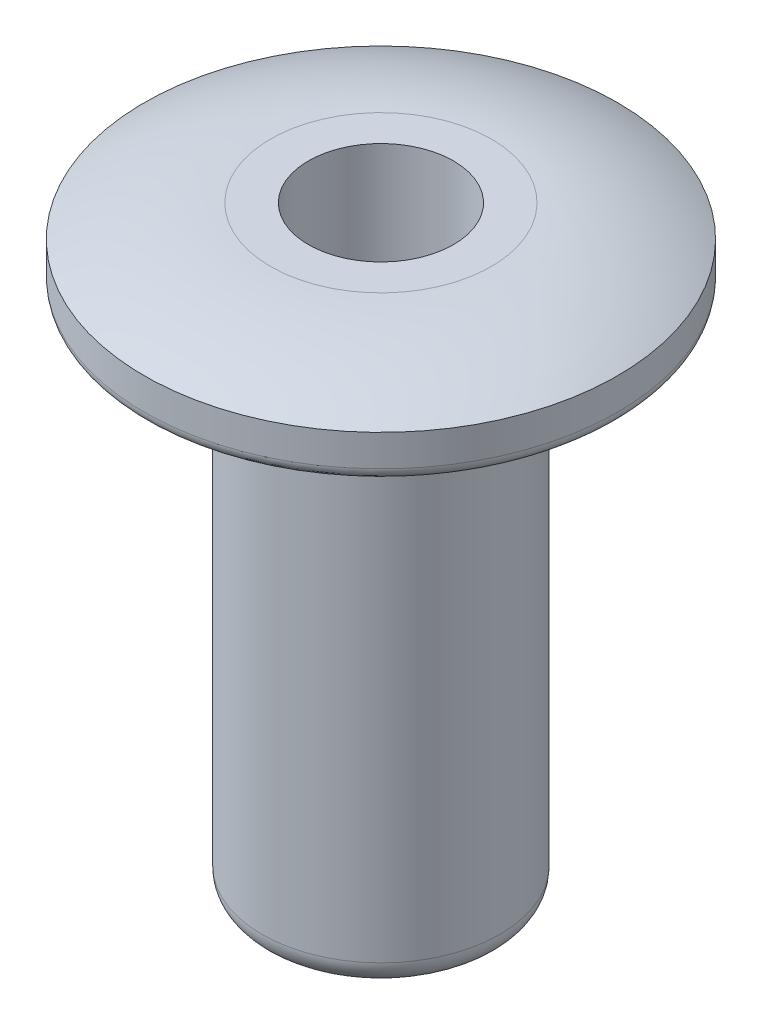
ISO-10303-21;
HEADER;
FILE_DESCRIPTION(('STEP AP214'),'2;1');
FILE_NAME('part.step','',(''),(''),'','','');
FILE_SCHEMA(('AUTOMOTIVE_DESIGN { 1 0 10303 214 1 1 1 1 }'));
ENDSEC;
DATA;
#1=APPLICATION_CONTEXT('core data for automotive mechanical design processes');
#2=APPLICATION_PROTOCOL_DEFINITION('international standard','automotive_design',2000,#1);
#3=PRODUCT_CONTEXT('',#1,'mechanical');
#4=PRODUCT('Part','Part','',(#3));
#5=PRODUCT_RELATED_PRODUCT_CATEGORY('part','',(#4));
#6=PRODUCT_DEFINITION_FORMATION('','',#4);
#7=PRODUCT_DEFINITION_CONTEXT('part definition',#1,'design');
#8=PRODUCT_DEFINITION('design','',#6,#7);
#9=PRODUCT_DEFINITION_SHAPE('','',#8);
#10=(LENGTH_UNIT() NAMED_UNIT(*) SI_UNIT(.MILLI.,.METRE.));
#11=(NAMED_UNIT(*) PLANE_ANGLE_UNIT() SI_UNIT($,.RADIAN.));
#12=(NAMED_UNIT(*) SI_UNIT($,.STERADIAN.) SOLID_ANGLE_UNIT());
#13=UNCERTAINTY_MEASURE_WITH_UNIT(LENGTH_MEASURE(1.E-05),#10,'distance_accuracy_value','');
#14=(GEOMETRIC_REPRESENTATION_CONTEXT(3) GLOBAL_UNCERTAINTY_ASSIGNED_CONTEXT((#13)) GLOBAL_UNIT_ASSIGNED_CONTEXT((#10,
#11,#12)) REPRESENTATION_CONTEXT('',''));
#15=CARTESIAN_POINT('',(0.,0.,0.));
#16=DIRECTION('',(0.,0.,1.));
#17=DIRECTION('',(1.,0.,0.));
#18=AXIS2_PLACEMENT_3D('',#15,#16,#17);
#19=CARTESIAN_POINT('',(-1.4605,12.065,0.));
#20=DIRECTION('',(0.,-1.,0.));
#21=DIRECTION('',(0.,0.,-1.));
#22=AXIS2_PLACEMENT_3D('',#19,#20,#21);
#23=PLANE('',#22);
#24=CARTESIAN_POINT('',(0.,12.065,0.));
#25=DIRECTION('',(0.,-1.,0.));
#26=DIRECTION('',(0.,0.,-1.));
#27=AXIS2_PLACEMENT_3D('',#24,#25,#26);
#28=CIRCLE('',#27,1.4605);
#29=CARTESIAN_POINT('',(0.,12.065,-1.4605));
#30=VERTEX_POINT('',#29);
#31=EDGE_CURVE('E18',#30,#30,#28,.T.);
#32=ORIENTED_EDGE('',*,*,#31,.T.);
#33=EDGE_LOOP('',(#32));
#34=FACE_BOUND('',#33,.T.);
#35=CARTESIAN_POINT('',(0.,12.065,0.));
#36=DIRECTION('',(0.,-1.,0.));
#37=DIRECTION('',(0.,0.,-1.));
#38=AXIS2_PLACEMENT_3D('',#35,#36,#37);
#39=CIRCLE('',#38,2.2225);
#40=CARTESIAN_POINT('',(0.,12.065,-2.2225));
#41=VERTEX_POINT('',#40);
#42=EDGE_CURVE('E47',#41,#41,#39,.T.);
#43=ORIENTED_EDGE('',*,*,#42,.F.);
#44=EDGE_LOOP('',(#43));
#45=FACE_BOUND('',#44,.T.);
#46=ADVANCED_FACE('F14',(#34,#45),#23,.F.);
#47=CARTESIAN_POINT('',(0.,6.66749999999997,-2.2225));
#48=DIRECTION('',(1.,0.,0.));
#49=DIRECTION('',(0.,0.,-1.));
#50=AXIS2_PLACEMENT_3D('',#47,#48,#49);
#51=CIRCLE('',#50,5.39750000000002);
#52=TRIMMED_CURVE('',#51,(PARAMETER_VALUE(-1.99518603538808)),
(PARAMETER_VALUE(1.99518603538808)),.T.,.PARAMETER.);
#53=CARTESIAN_POINT('',(0.,6.66749999999997,0.));
#54=DIRECTION('',(0.,-1.,0.));
#55=AXIS1_PLACEMENT('',#53,#54);
#56=SURFACE_OF_REVOLUTION('',#52,#55);
#57=ORIENTED_EDGE('',*,*,#42,.T.);
#58=EDGE_LOOP('',(#57));
#59=FACE_BOUND('',#58,.T.);
#60=CARTESIAN_POINT('',(0.,11.43,0.));
#61=DIRECTION('',(0.,-1.,0.));
#62=DIRECTION('',(0.,0.,-1.));
#63=AXIS2_PLACEMENT_3D('',#60,#61,#62);
#64=CIRCLE('',#63,4.7625);
#65=CARTESIAN_POINT('',(0.,11.43,-4.7625));
#66=VERTEX_POINT('',#65);
#67=EDGE_CURVE('E36',#66,#66,#64,.T.);
#68=ORIENTED_EDGE('',*,*,#67,.F.);
#69=EDGE_LOOP('',(#68));
#70=FACE_BOUND('',#69,.T.);
#71=ADVANCED_FACE('F60',(#59,#70),#56,.F.);
#72=CARTESIAN_POINT('',(0.,0.,0.));
#73=DIRECTION('',(0.,-1.,0.));
#74=DIRECTION('',(0.,0.,-1.));
#75=AXIS2_PLACEMENT_3D('',#72,#73,#74);
#76=CYLINDRICAL_SURFACE('',#75,1.4605);
#77=CARTESIAN_POINT('',(0.,0.,0.));
#78=DIRECTION('',(0.,-1.,0.));
#79=DIRECTION('',(0.,0.,-1.));
#80=AXIS2_PLACEMENT_3D('',#77,#78,#79);
#81=CIRCLE('',#80,1.4605);
#82=CARTESIAN_POINT('',(0.,0.,-1.4605));
#83=VERTEX_POINT('',#82);
#84=EDGE_CURVE('E33',#83,#83,#81,.T.);
#85=ORIENTED_EDGE('',*,*,#84,.T.);
#86=EDGE_LOOP('',(#85));
#87=FACE_BOUND('',#86,.T.);
#88=ORIENTED_EDGE('',*,*,#31,.F.);
#89=EDGE_LOOP('',(#88));
#90=FACE_BOUND('',#89,.T.);
#91=ADVANCED_FACE('F64',(#87,#90),#76,.F.);
#92=CARTESIAN_POINT('',(0.,0.,0.));
#93=DIRECTION('',(0.,-1.,0.));
#94=DIRECTION('',(0.,0.,-1.));
#95=AXIS2_PLACEMENT_3D('',#92,#93,#94);
#96=CYLINDRICAL_SURFACE('',#95,4.7625);
#97=ORIENTED_EDGE('',*,*,#67,.T.);
#98=EDGE_LOOP('',(#97));
#99=FACE_BOUND('',#98,.T.);
#100=CARTESIAN_POINT('',(0.,10.795,0.));
#101=DIRECTION('',(0.,-1.,0.));
#102=DIRECTION('',(0.,0.,-1.));
#103=AXIS2_PLACEMENT_3D('',#100,#101,#102);
#104=CIRCLE('',#103,4.7625);
#105=CARTESIAN_POINT('',(0.,10.795,-4.7625));
#106=VERTEX_POINT('',#105);
#107=EDGE_CURVE('E35',#106,#106,#104,.T.);
#108=ORIENTED_EDGE('',*,*,#107,.F.);
#109=EDGE_LOOP('',(#108));
#110=FACE_BOUND('',#109,.T.);
#111=ADVANCED_FACE('F68',(#99,#110),#96,.T.);
#112=CARTESIAN_POINT('',(-2.39395,0.,0.));
#113=DIRECTION('',(0.,1.,0.));
#114=DIRECTION('',(0.,0.,1.));
#115=AXIS2_PLACEMENT_3D('',#112,#113,#114);
#116=PLANE('',#115);
#117=ORIENTED_EDGE('',*,*,#84,.F.);
#118=EDGE_LOOP('',(#117));
#119=FACE_BOUND('',#118,.T.);
#120=CARTESIAN_POINT('',(0.,0.,0.));
#121=DIRECTION('',(0.,1.,0.));
#122=DIRECTION('',(0.,0.,1.));
#123=AXIS2_PLACEMENT_3D('',#120,#121,#122);
#124=CIRCLE('',#123,1.88595);
#125=CARTESIAN_POINT('',(0.,0.,1.88595));
#126=VERTEX_POINT('',#125);
#127=EDGE_CURVE('E40',#126,#126,#124,.T.);
#128=ORIENTED_EDGE('',*,*,#127,.F.);
#129=EDGE_LOOP('',(#128));
#130=FACE_BOUND('',#129,.T.);
#131=ADVANCED_FACE('F71',(#119,#130),#116,.F.);
#132=CARTESIAN_POINT('',(0.,10.795,0.));
#133=DIRECTION('',(0.,-1.,0.));
#134=DIRECTION('',(0.,0.,-1.));
#135=AXIS2_PLACEMENT_3D('',#132,#133,#134);
#136=TOROIDAL_SURFACE('',#135,4.5085,0.254000000000002);
#137=ORIENTED_EDGE('',*,*,#107,.T.);
#138=EDGE_LOOP('',(#137));
#139=FACE_BOUND('',#138,.T.);
#140=CARTESIAN_POINT('',(0.,10.541,0.));
#141=DIRECTION('',(0.,1.,0.));
#142=DIRECTION('',(0.,0.,-1.));
#143=AXIS2_PLACEMENT_3D('',#140,#141,#142);
#144=CIRCLE('',#143,4.5085);
#145=CARTESIAN_POINT('',(0.,10.541,-4.5085));
#146=VERTEX_POINT('',#145);
#147=EDGE_CURVE('E27',#146,#146,#144,.T.);
#148=ORIENTED_EDGE('',*,*,#147,.T.);
#149=EDGE_LOOP('',(#148));
#150=FACE_BOUND('',#149,.T.);
#151=ADVANCED_FACE('F75',(#139,#150),#136,.T.);
#152=CARTESIAN_POINT('',(0.,0.508,0.));
#153=DIRECTION('',(0.,1.,0.));
#154=DIRECTION('',(0.,0.,1.));
#155=AXIS2_PLACEMENT_3D('',#152,#153,#154);
#156=TOROIDAL_SURFACE('',#155,1.88595,0.508);
#157=ORIENTED_EDGE('',*,*,#127,.T.);
#158=EDGE_LOOP('',(#157));
#159=FACE_BOUND('',#158,.T.);
#160=CARTESIAN_POINT('',(0.,0.508,0.));
#161=DIRECTION('',(0.,-1.,0.));
#162=DIRECTION('',(0.,0.,-1.));
#163=AXIS2_PLACEMENT_3D('',#160,#161,#162);
#164=CIRCLE('',#163,2.39395);
#165=CARTESIAN_POINT('',(0.,0.508,-2.39395));
#166=VERTEX_POINT('',#165);
#167=EDGE_CURVE('E22',#166,#166,#164,.F.);
#168=ORIENTED_EDGE('',*,*,#167,.F.);
#169=EDGE_LOOP('',(#168));
#170=FACE_BOUND('',#169,.T.);
#171=ADVANCED_FACE('F92',(#159,#170),#156,.T.);
#172=CARTESIAN_POINT('',(-4.5085,10.541,0.));
#173=DIRECTION('',(0.,1.,0.));
#174=DIRECTION('',(0.,0.,1.));
#175=AXIS2_PLACEMENT_3D('',#172,#173,#174);
#176=PLANE('',#175);
#177=ORIENTED_EDGE('',*,*,#147,.F.);
#178=EDGE_LOOP('',(#177));
#179=FACE_BOUND('',#178,.T.);
#180=CARTESIAN_POINT('',(0.,10.541,0.));
#181=DIRECTION('',(0.,-1.,0.));
#182=DIRECTION('',(0.,0.,-1.));
#183=AXIS2_PLACEMENT_3D('',#180,#181,#182);
#184=CIRCLE('',#183,2.39395);
#185=CARTESIAN_POINT('',(0.,10.541,-2.39395));
#186=VERTEX_POINT('',#185);
#187=EDGE_CURVE('E10',#186,#186,#184,.T.);
#188=ORIENTED_EDGE('',*,*,#187,.F.);
#189=EDGE_LOOP('',(#188));
#190=FACE_BOUND('',#189,.T.);
#191=ADVANCED_FACE('F119',(#179,#190),#176,.F.);
#192=CARTESIAN_POINT('',(0.,0.,0.));
#193=DIRECTION('',(0.,-1.,0.));
#194=DIRECTION('',(0.,0.,-1.));
#195=AXIS2_PLACEMENT_3D('',#192,#193,#194);
#196=CYLINDRICAL_SURFACE('',#195,2.39395);
#197=ORIENTED_EDGE('',*,*,#187,.T.);
#198=EDGE_LOOP('',(#197));
#199=FACE_BOUND('',#198,.T.);
#200=ORIENTED_EDGE('',*,*,#167,.T.);
#201=EDGE_LOOP('',(#200));
#202=FACE_BOUND('',#201,.T.);
#203=ADVANCED_FACE('F123',(#199,#202),#196,.T.);
#204=CLOSED_SHELL('',(#46,#71,#91,#111,#131,#151,#171,#191,#203));
#205=MANIFOLD_SOLID_BREP('B1',#204);
#206=ADVANCED_BREP_SHAPE_REPRESENTATION('',(#18,#205),#14);
#207=SHAPE_DEFINITION_REPRESENTATION(#9,#206);
ENDSEC;
END-ISO-10303-21;
